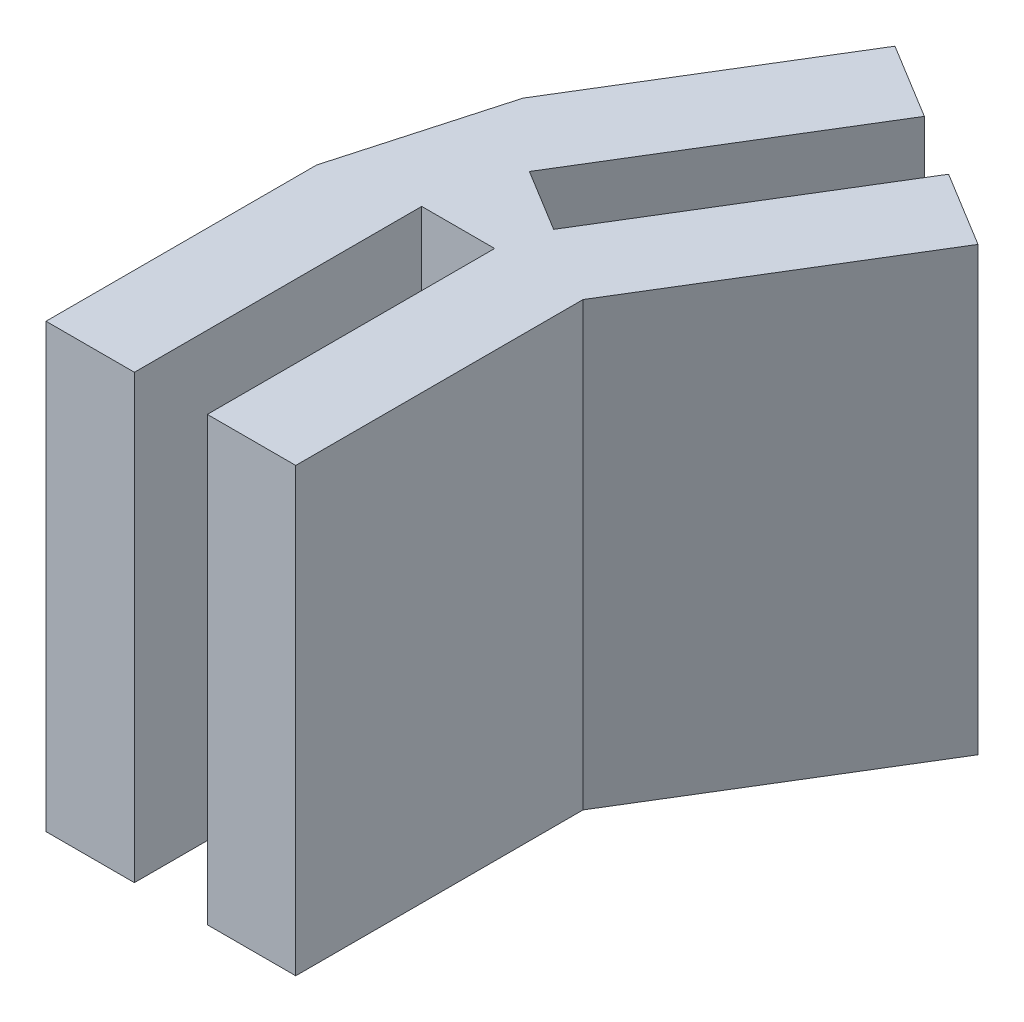
ISO-10303-21;
HEADER;
FILE_DESCRIPTION(('STEP AP214'),'2;1');
FILE_NAME('part.step','',(''),(''),'','','');
FILE_SCHEMA(('AUTOMOTIVE_DESIGN { 1 0 10303 214 1 1 1 1 }'));
ENDSEC;
DATA;
#1=APPLICATION_CONTEXT('core data for automotive mechanical design processes');
#2=APPLICATION_PROTOCOL_DEFINITION('international standard','automotive_design',2000,#1);
#3=PRODUCT_CONTEXT('',#1,'mechanical');
#4=PRODUCT('Part','Part','',(#3));
#5=PRODUCT_RELATED_PRODUCT_CATEGORY('part','',(#4));
#6=PRODUCT_DEFINITION_FORMATION('','',#4);
#7=PRODUCT_DEFINITION_CONTEXT('part definition',#1,'design');
#8=PRODUCT_DEFINITION('design','',#6,#7);
#9=PRODUCT_DEFINITION_SHAPE('','',#8);
#10=(LENGTH_UNIT() NAMED_UNIT(*) SI_UNIT(.MILLI.,.METRE.));
#11=(NAMED_UNIT(*) PLANE_ANGLE_UNIT() SI_UNIT($,.RADIAN.));
#12=(NAMED_UNIT(*) SI_UNIT($,.STERADIAN.) SOLID_ANGLE_UNIT());
#13=UNCERTAINTY_MEASURE_WITH_UNIT(LENGTH_MEASURE(1.E-05),#10,'distance_accuracy_value','');
#14=(GEOMETRIC_REPRESENTATION_CONTEXT(3) GLOBAL_UNCERTAINTY_ASSIGNED_CONTEXT((#13)) GLOBAL_UNIT_ASSIGNED_CONTEXT((#10,
#11,#12)) REPRESENTATION_CONTEXT('',''));
#15=CARTESIAN_POINT('',(0.,0.,0.));
#16=DIRECTION('',(0.,0.,1.));
#17=DIRECTION('',(1.,0.,0.));
#18=AXIS2_PLACEMENT_3D('',#15,#16,#17);
#19=CARTESIAN_POINT('',(0.,20.,-12.2410642276233));
#20=DIRECTION('',(-0.962691746426481,0.,-0.270600445975857));
#21=DIRECTION('',(0.,1.,0.));
#22=AXIS2_PLACEMENT_3D('',#19,#20,#21);
#23=PLANE('',#22);
#24=DIRECTION('',(0.,-1.,0.));
#25=VECTOR('',#24,1.);
#26=CARTESIAN_POINT('',(0.,20.,-12.2410642276233));
#27=LINE('',#26,#25);
#28=CARTESIAN_POINT('',(0.,20.,-12.2410642276233));
#29=VERTEX_POINT('',#28);
#30=CARTESIAN_POINT('',(0.,0.,-12.2410642276233));
#31=VERTEX_POINT('',#30);
#32=EDGE_CURVE('E301',#29,#31,#27,.T.);
#33=ORIENTED_EDGE('',*,*,#32,.F.);
#34=DIRECTION('',(-0.270600445975857,0.,0.962691746426481));
#35=VECTOR('',#34,1.);
#36=CARTESIAN_POINT('',(0.,20.,-12.2410642276233));
#37=LINE('',#36,#35);
#38=CARTESIAN_POINT('',(2.05028883814531,20.,-19.5351990733912));
#39=VERTEX_POINT('',#38);
#40=EDGE_CURVE('E51',#39,#29,#37,.T.);
#41=ORIENTED_EDGE('',*,*,#40,.F.);
#42=DIRECTION('',(0.,1.,0.));
#43=VECTOR('',#42,1.);
#44=CARTESIAN_POINT('',(2.05028883814531,20.,-19.5351990733912));
#45=LINE('',#44,#43);
#46=CARTESIAN_POINT('',(2.05028883814531,0.,-19.5351990733912));
#47=VERTEX_POINT('',#46);
#48=EDGE_CURVE('E305',#47,#39,#45,.T.);
#49=ORIENTED_EDGE('',*,*,#48,.F.);
#50=DIRECTION('',(0.270600445975857,0.,-0.962691746426481));
#51=VECTOR('',#50,1.);
#52=CARTESIAN_POINT('',(-3.18885618328537,0.,-0.896347048318427));
#53=LINE('',#52,#51);
#54=EDGE_CURVE('E13',#31,#47,#53,.T.);
#55=ORIENTED_EDGE('',*,*,#54,.F.);
#56=EDGE_LOOP('',(#33,#41,#49,#55));
#57=FACE_BOUND('',#56,.T.);
#58=ADVANCED_FACE('F43',(#57),#23,.T.);
#59=CARTESIAN_POINT('',(0.,20.,0.));
#60=DIRECTION('',(1.,0.,0.));
#61=DIRECTION('',(0.,0.,-1.));
#62=AXIS2_PLACEMENT_3D('',#59,#60,#61);
#63=PLANE('',#62);
#64=DIRECTION('',(0.,0.,1.));
#65=VECTOR('',#64,1.);
#66=CARTESIAN_POINT('',(0.,20.,0.));
#67=LINE('',#66,#65);
#68=CARTESIAN_POINT('',(0.,20.,0.));
#69=VERTEX_POINT('',#68);
#70=EDGE_CURVE('E234',#29,#69,#67,.T.);
#71=ORIENTED_EDGE('',*,*,#70,.F.);
#72=ORIENTED_EDGE('',*,*,#32,.T.);
#73=DIRECTION('',(0.,0.,1.));
#74=VECTOR('',#73,1.);
#75=CARTESIAN_POINT('',(0.,0.,0.));
#76=LINE('',#75,#74);
#77=CARTESIAN_POINT('',(0.,0.,0.));
#78=VERTEX_POINT('',#77);
#79=EDGE_CURVE('E159',#31,#78,#76,.T.);
#80=ORIENTED_EDGE('',*,*,#79,.T.);
#81=DIRECTION('',(0.,-1.,0.));
#82=VECTOR('',#81,1.);
#83=CARTESIAN_POINT('',(0.,20.,0.));
#84=LINE('',#83,#82);
#85=EDGE_CURVE('E297',#69,#78,#84,.T.);
#86=ORIENTED_EDGE('',*,*,#85,.F.);
#87=EDGE_LOOP('',(#71,#72,#80,#86));
#88=FACE_BOUND('',#87,.T.);
#89=ADVANCED_FACE('F313',(#88),#63,.F.);
#90=CARTESIAN_POINT('',(0.,20.,0.));
#91=DIRECTION('',(0.,0.,-1.));
#92=DIRECTION('',(-1.,0.,0.));
#93=AXIS2_PLACEMENT_3D('',#90,#91,#92);
#94=PLANE('',#93);
#95=DIRECTION('',(1.,0.,0.));
#96=VECTOR('',#95,1.);
#97=CARTESIAN_POINT('',(0.,0.,0.));
#98=LINE('',#97,#96);
#99=CARTESIAN_POINT('',(4.,0.,0.));
#100=VERTEX_POINT('',#99);
#101=EDGE_CURVE('E258',#78,#100,#98,.T.);
#102=ORIENTED_EDGE('',*,*,#101,.T.);
#103=DIRECTION('',(0.,-1.,0.));
#104=VECTOR('',#103,1.);
#105=CARTESIAN_POINT('',(4.,20.,0.));
#106=LINE('',#105,#104);
#107=CARTESIAN_POINT('',(4.,20.,0.));
#108=VERTEX_POINT('',#107);
#109=EDGE_CURVE('E293',#108,#100,#106,.T.);
#110=ORIENTED_EDGE('',*,*,#109,.F.);
#111=DIRECTION('',(1.,0.,0.));
#112=VECTOR('',#111,1.);
#113=CARTESIAN_POINT('',(0.,20.,0.));
#114=LINE('',#113,#112);
#115=EDGE_CURVE('E237',#69,#108,#114,.T.);
#116=ORIENTED_EDGE('',*,*,#115,.F.);
#117=ORIENTED_EDGE('',*,*,#85,.T.);
#118=EDGE_LOOP('',(#102,#110,#116,#117));
#119=FACE_BOUND('',#118,.T.);
#120=ADVANCED_FACE('F316',(#119),#94,.F.);
#121=CARTESIAN_POINT('',(4.,20.,0.));
#122=DIRECTION('',(-1.,0.,0.));
#123=DIRECTION('',(0.,0.,1.));
#124=AXIS2_PLACEMENT_3D('',#121,#122,#123);
#125=PLANE('',#124);
#126=DIRECTION('',(0.,0.,-1.));
#127=VECTOR('',#126,1.);
#128=CARTESIAN_POINT('',(4.,0.,0.));
#129=LINE('',#128,#127);
#130=CARTESIAN_POINT('',(4.,0.,-13.));
#131=VERTEX_POINT('',#130);
#132=EDGE_CURVE('E261',#100,#131,#129,.T.);
#133=ORIENTED_EDGE('',*,*,#132,.T.);
#134=DIRECTION('',(0.,-1.,0.));
#135=VECTOR('',#134,1.);
#136=CARTESIAN_POINT('',(4.,20.,-13.));
#137=LINE('',#136,#135);
#138=CARTESIAN_POINT('',(4.,20.,-13.));
#139=VERTEX_POINT('',#138);
#140=EDGE_CURVE('E289',#139,#131,#137,.T.);
#141=ORIENTED_EDGE('',*,*,#140,.F.);
#142=DIRECTION('',(0.,0.,-1.));
#143=VECTOR('',#142,1.);
#144=CARTESIAN_POINT('',(4.,20.,0.));
#145=LINE('',#144,#143);
#146=EDGE_CURVE('E241',#108,#139,#145,.T.);
#147=ORIENTED_EDGE('',*,*,#146,.F.);
#148=ORIENTED_EDGE('',*,*,#109,.T.);
#149=EDGE_LOOP('',(#133,#141,#147,#148));
#150=FACE_BOUND('',#149,.T.);
#151=ADVANCED_FACE('F323',(#150),#125,.F.);
#152=CARTESIAN_POINT('',(4.,20.,-13.));
#153=DIRECTION('',(0.,0.,-1.));
#154=DIRECTION('',(-1.,0.,0.));
#155=AXIS2_PLACEMENT_3D('',#152,#153,#154);
#156=PLANE('',#155);
#157=DIRECTION('',(1.,0.,0.));
#158=VECTOR('',#157,1.);
#159=CARTESIAN_POINT('',(4.,0.,-13.));
#160=LINE('',#159,#158);
#161=CARTESIAN_POINT('',(7.3,0.,-13.));
#162=VERTEX_POINT('',#161);
#163=EDGE_CURVE('E264',#131,#162,#160,.T.);
#164=ORIENTED_EDGE('',*,*,#163,.T.);
#165=DIRECTION('',(0.,-1.,0.));
#166=VECTOR('',#165,1.);
#167=CARTESIAN_POINT('',(7.3,20.,-13.));
#168=LINE('',#167,#166);
#169=CARTESIAN_POINT('',(7.3,20.,-13.));
#170=VERTEX_POINT('',#169);
#171=EDGE_CURVE('E285',#170,#162,#168,.T.);
#172=ORIENTED_EDGE('',*,*,#171,.F.);
#173=DIRECTION('',(1.,0.,0.));
#174=VECTOR('',#173,1.);
#175=CARTESIAN_POINT('',(4.,20.,-13.));
#176=LINE('',#175,#174);
#177=EDGE_CURVE('E244',#139,#170,#176,.T.);
#178=ORIENTED_EDGE('',*,*,#177,.F.);
#179=ORIENTED_EDGE('',*,*,#140,.T.);
#180=EDGE_LOOP('',(#164,#172,#178,#179));
#181=FACE_BOUND('',#180,.T.);
#182=ADVANCED_FACE('F327',(#181),#156,.F.);
#183=CARTESIAN_POINT('',(7.3,20.,-13.));
#184=DIRECTION('',(1.,0.,0.));
#185=DIRECTION('',(0.,0.,-1.));
#186=AXIS2_PLACEMENT_3D('',#183,#184,#185);
#187=PLANE('',#186);
#188=DIRECTION('',(0.,0.,1.));
#189=VECTOR('',#188,1.);
#190=CARTESIAN_POINT('',(7.3,0.,-13.));
#191=LINE('',#190,#189);
#192=CARTESIAN_POINT('',(7.3,0.,0.));
#193=VERTEX_POINT('',#192);
#194=EDGE_CURVE('E267',#162,#193,#191,.T.);
#195=ORIENTED_EDGE('',*,*,#194,.T.);
#196=DIRECTION('',(0.,-1.,0.));
#197=VECTOR('',#196,1.);
#198=CARTESIAN_POINT('',(7.3,20.,0.));
#199=LINE('',#198,#197);
#200=CARTESIAN_POINT('',(7.3,20.,0.));
#201=VERTEX_POINT('',#200);
#202=EDGE_CURVE('E281',#201,#193,#199,.T.);
#203=ORIENTED_EDGE('',*,*,#202,.F.);
#204=DIRECTION('',(0.,0.,1.));
#205=VECTOR('',#204,1.);
#206=CARTESIAN_POINT('',(7.3,20.,-13.));
#207=LINE('',#206,#205);
#208=EDGE_CURVE('E247',#170,#201,#207,.T.);
#209=ORIENTED_EDGE('',*,*,#208,.F.);
#210=ORIENTED_EDGE('',*,*,#171,.T.);
#211=EDGE_LOOP('',(#195,#203,#209,#210));
#212=FACE_BOUND('',#211,.T.);
#213=ADVANCED_FACE('F332',(#212),#187,.F.);
#214=CARTESIAN_POINT('',(7.3,20.,0.));
#215=DIRECTION('',(0.,0.,-1.));
#216=DIRECTION('',(-1.,0.,0.));
#217=AXIS2_PLACEMENT_3D('',#214,#215,#216);
#218=PLANE('',#217);
#219=DIRECTION('',(1.,0.,0.));
#220=VECTOR('',#219,1.);
#221=CARTESIAN_POINT('',(7.3,0.,0.));
#222=LINE('',#221,#220);
#223=CARTESIAN_POINT('',(11.3,0.,0.));
#224=VERTEX_POINT('',#223);
#225=EDGE_CURVE('E270',#193,#224,#222,.T.);
#226=ORIENTED_EDGE('',*,*,#225,.T.);
#227=DIRECTION('',(0.,-1.,0.));
#228=VECTOR('',#227,1.);
#229=CARTESIAN_POINT('',(11.3,20.,0.));
#230=LINE('',#229,#228);
#231=CARTESIAN_POINT('',(11.3,20.,0.));
#232=VERTEX_POINT('',#231);
#233=EDGE_CURVE('E277',#232,#224,#230,.T.);
#234=ORIENTED_EDGE('',*,*,#233,.F.);
#235=DIRECTION('',(1.,0.,0.));
#236=VECTOR('',#235,1.);
#237=CARTESIAN_POINT('',(7.3,20.,0.));
#238=LINE('',#237,#236);
#239=EDGE_CURVE('E250',#201,#232,#238,.T.);
#240=ORIENTED_EDGE('',*,*,#239,.F.);
#241=ORIENTED_EDGE('',*,*,#202,.T.);
#242=EDGE_LOOP('',(#226,#234,#240,#241));
#243=FACE_BOUND('',#242,.T.);
#244=ADVANCED_FACE('F336',(#243),#218,.F.);
#245=CARTESIAN_POINT('',(11.3,20.,0.));
#246=DIRECTION('',(-1.,0.,0.));
#247=DIRECTION('',(0.,0.,1.));
#248=AXIS2_PLACEMENT_3D('',#245,#246,#247);
#249=PLANE('',#248);
#250=DIRECTION('',(0.,0.,-1.));
#251=VECTOR('',#250,1.);
#252=CARTESIAN_POINT('',(11.3,0.,0.));
#253=LINE('',#252,#251);
#254=CARTESIAN_POINT('',(11.3,0.,-13.));
#255=VERTEX_POINT('',#254);
#256=EDGE_CURVE('E238',#224,#255,#253,.T.);
#257=ORIENTED_EDGE('',*,*,#256,.T.);
#258=DIRECTION('',(0.,-1.,0.));
#259=VECTOR('',#258,1.);
#260=CARTESIAN_POINT('',(11.3,20.,-13.));
#261=LINE('',#260,#259);
#262=CARTESIAN_POINT('',(11.3,20.,-13.));
#263=VERTEX_POINT('',#262);
#264=EDGE_CURVE('E255',#263,#255,#261,.T.);
#265=ORIENTED_EDGE('',*,*,#264,.F.);
#266=DIRECTION('',(0.,0.,-1.));
#267=VECTOR('',#266,1.);
#268=CARTESIAN_POINT('',(11.3,20.,0.));
#269=LINE('',#268,#267);
#270=EDGE_CURVE('E170',#232,#263,#269,.T.);
#271=ORIENTED_EDGE('',*,*,#270,.F.);
#272=ORIENTED_EDGE('',*,*,#233,.T.);
#273=EDGE_LOOP('',(#257,#265,#271,#272));
#274=FACE_BOUND('',#273,.T.);
#275=ADVANCED_FACE('F340',(#274),#249,.F.);
#276=CARTESIAN_POINT('',(0.,20.,0.));
#277=DIRECTION('',(0.,-1.,0.));
#278=DIRECTION('',(0.,0.,-1.));
#279=AXIS2_PLACEMENT_3D('',#276,#277,#278);
#280=PLANE('',#279);
#281=DIRECTION('',(0.521009631840564,0.,-0.853550797275335));
#282=VECTOR('',#281,1.);
#283=CARTESIAN_POINT('',(8.42800120471605,20.,-29.9835692043777));
#284=LINE('',#283,#282);
#285=CARTESIAN_POINT('',(8.42800120471605,20.,-29.9835692043777));
#286=VERTEX_POINT('',#285);
#287=EDGE_CURVE('E173',#39,#286,#284,.T.);
#288=ORIENTED_EDGE('',*,*,#287,.F.);
#289=ORIENTED_EDGE('',*,*,#40,.T.);
#290=ORIENTED_EDGE('',*,*,#70,.T.);
#291=ORIENTED_EDGE('',*,*,#115,.T.);
#292=ORIENTED_EDGE('',*,*,#146,.T.);
#293=ORIENTED_EDGE('',*,*,#177,.T.);
#294=ORIENTED_EDGE('',*,*,#208,.T.);
#295=ORIENTED_EDGE('',*,*,#239,.T.);
#296=ORIENTED_EDGE('',*,*,#270,.T.);
#297=DIRECTION('',(-0.521009631840564,0.,0.853550797275335));
#298=VECTOR('',#297,1.);
#299=CARTESIAN_POINT('',(18.0731252139273,20.,-24.0961603645794));
#300=LINE('',#299,#298);
#301=CARTESIAN_POINT('',(18.0731252139273,20.,-24.0961603645794));
#302=VERTEX_POINT('',#301);
#303=EDGE_CURVE('E151',#302,#263,#300,.T.);
#304=ORIENTED_EDGE('',*,*,#303,.F.);
#305=DIRECTION('',(0.853550797275335,0.,0.521009631840564));
#306=VECTOR('',#305,1.);
#307=CARTESIAN_POINT('',(14.658922024826,20.,-26.1801988919416));
#308=LINE('',#307,#306);
#309=CARTESIAN_POINT('',(14.658922024826,20.,-26.1801988919416));
#310=VERTEX_POINT('',#309);
#311=EDGE_CURVE('E167',#310,#302,#308,.T.);
#312=ORIENTED_EDGE('',*,*,#311,.F.);
#313=DIRECTION('',(0.521009631840564,0.,-0.853550797275335));
#314=VECTOR('',#313,1.);
#315=CARTESIAN_POINT('',(7.88579681089866,20.,-15.0840385273623));
#316=LINE('',#315,#314);
#317=CARTESIAN_POINT('',(7.88579681089866,20.,-15.0840385273623));
#318=VERTEX_POINT('',#317);
#319=EDGE_CURVE('E177',#318,#310,#316,.T.);
#320=ORIENTED_EDGE('',*,*,#319,.F.);
#321=DIRECTION('',(0.853550797275335,0.,0.521009631840564));
#322=VECTOR('',#321,1.);
#323=CARTESIAN_POINT('',(5.06907917989005,20.,-16.8033703124361));
#324=LINE('',#323,#322);
#325=CARTESIAN_POINT('',(5.06907917989005,20.,-16.8033703124361));
#326=VERTEX_POINT('',#325);
#327=EDGE_CURVE('E180',#326,#318,#324,.T.);
#328=ORIENTED_EDGE('',*,*,#327,.F.);
#329=DIRECTION('',(-0.521009631840564,0.,0.853550797275335));
#330=VECTOR('',#329,1.);
#331=CARTESIAN_POINT('',(11.8422043938174,20.,-27.8995306770155));
#332=LINE('',#331,#330);
#333=CARTESIAN_POINT('',(11.8422043938174,20.,-27.8995306770155));
#334=VERTEX_POINT('',#333);
#335=EDGE_CURVE('E187',#334,#326,#332,.T.);
#336=ORIENTED_EDGE('',*,*,#335,.F.);
#337=DIRECTION('',(0.853550797275335,0.,0.521009631840564));
#338=VECTOR('',#337,1.);
#339=CARTESIAN_POINT('',(8.42800120471605,20.,-29.9835692043777));
#340=LINE('',#339,#338);
#341=EDGE_CURVE('E191',#286,#334,#340,.T.);
#342=ORIENTED_EDGE('',*,*,#341,.F.);
#343=EDGE_LOOP('',(#288,#289,#290,#291,#292,#293,#294,#295,#296,#304,#312,#320,#328,#336,#342));
#344=FACE_BOUND('',#343,.T.);
#345=ADVANCED_FACE('F165',(#344),#280,.F.);
#346=CARTESIAN_POINT('',(0.,0.,0.));
#347=DIRECTION('',(0.,-1.,0.));
#348=DIRECTION('',(0.,0.,-1.));
#349=AXIS2_PLACEMENT_3D('',#346,#347,#348);
#350=PLANE('',#349);
#351=ORIENTED_EDGE('',*,*,#79,.F.);
#352=ORIENTED_EDGE('',*,*,#54,.T.);
#353=DIRECTION('',(0.521009631840564,0.,-0.853550797275335));
#354=VECTOR('',#353,1.);
#355=CARTESIAN_POINT('',(8.42800120471605,0.,-29.9835692043777));
#356=LINE('',#355,#354);
#357=CARTESIAN_POINT('',(8.42800120471605,0.,-29.9835692043777));
#358=VERTEX_POINT('',#357);
#359=EDGE_CURVE('E196',#47,#358,#356,.T.);
#360=ORIENTED_EDGE('',*,*,#359,.T.);
#361=DIRECTION('',(0.853550797275335,0.,0.521009631840564));
#362=VECTOR('',#361,1.);
#363=CARTESIAN_POINT('',(8.42800120471605,0.,-29.9835692043777));
#364=LINE('',#363,#362);
#365=CARTESIAN_POINT('',(11.8422043938174,0.,-27.8995306770155));
#366=VERTEX_POINT('',#365);
#367=EDGE_CURVE('E216',#358,#366,#364,.T.);
#368=ORIENTED_EDGE('',*,*,#367,.T.);
#369=DIRECTION('',(-0.521009631840564,0.,0.853550797275335));
#370=VECTOR('',#369,1.);
#371=CARTESIAN_POINT('',(11.8422043938174,0.,-27.8995306770155));
#372=LINE('',#371,#370);
#373=CARTESIAN_POINT('',(5.06907917989005,0.,-16.8033703124361));
#374=VERTEX_POINT('',#373);
#375=EDGE_CURVE('E212',#366,#374,#372,.T.);
#376=ORIENTED_EDGE('',*,*,#375,.T.);
#377=DIRECTION('',(0.853550797275335,0.,0.521009631840564));
#378=VECTOR('',#377,1.);
#379=CARTESIAN_POINT('',(5.06907917989005,0.,-16.8033703124361));
#380=LINE('',#379,#378);
#381=CARTESIAN_POINT('',(7.88579681089866,0.,-15.0840385273623));
#382=VERTEX_POINT('',#381);
#383=EDGE_CURVE('E208',#374,#382,#380,.T.);
#384=ORIENTED_EDGE('',*,*,#383,.T.);
#385=DIRECTION('',(0.521009631840564,0.,-0.853550797275335));
#386=VECTOR('',#385,1.);
#387=CARTESIAN_POINT('',(7.88579681089866,0.,-15.0840385273623));
#388=LINE('',#387,#386);
#389=CARTESIAN_POINT('',(14.658922024826,0.,-26.1801988919416));
#390=VERTEX_POINT('',#389);
#391=EDGE_CURVE('E204',#382,#390,#388,.T.);
#392=ORIENTED_EDGE('',*,*,#391,.T.);
#393=DIRECTION('',(0.853550797275335,0.,0.521009631840564));
#394=VECTOR('',#393,1.);
#395=CARTESIAN_POINT('',(14.658922024826,0.,-26.1801988919416));
#396=LINE('',#395,#394);
#397=CARTESIAN_POINT('',(18.0731252139273,0.,-24.0961603645794));
#398=VERTEX_POINT('',#397);
#399=EDGE_CURVE('E201',#390,#398,#396,.T.);
#400=ORIENTED_EDGE('',*,*,#399,.T.);
#401=DIRECTION('',(-0.521009631840564,0.,0.853550797275335));
#402=VECTOR('',#401,1.);
#403=CARTESIAN_POINT('',(18.0731252139273,0.,-24.0961603645794));
#404=LINE('',#403,#402);
#405=EDGE_CURVE('E153',#398,#255,#404,.T.);
#406=ORIENTED_EDGE('',*,*,#405,.T.);
#407=ORIENTED_EDGE('',*,*,#256,.F.);
#408=ORIENTED_EDGE('',*,*,#225,.F.);
#409=ORIENTED_EDGE('',*,*,#194,.F.);
#410=ORIENTED_EDGE('',*,*,#163,.F.);
#411=ORIENTED_EDGE('',*,*,#132,.F.);
#412=ORIENTED_EDGE('',*,*,#101,.F.);
#413=EDGE_LOOP('',(#351,#352,#360,#368,#376,#384,#392,#400,#406,#407,#408,#409,#410,#411,#412));
#414=FACE_BOUND('',#413,.T.);
#415=ADVANCED_FACE('F341',(#414),#350,.T.);
#416=CARTESIAN_POINT('',(8.42800120471605,20.,-29.9835692043777));
#417=DIRECTION('',(-0.853550797275335,0.,-0.521009631840564));
#418=DIRECTION('',(-0.521009631840564,0.,0.853550797275335));
#419=AXIS2_PLACEMENT_3D('',#416,#417,#418);
#420=PLANE('',#419);
#421=ORIENTED_EDGE('',*,*,#359,.F.);
#422=ORIENTED_EDGE('',*,*,#48,.T.);
#423=ORIENTED_EDGE('',*,*,#287,.T.);
#424=DIRECTION('',(0.,-1.,0.));
#425=VECTOR('',#424,1.);
#426=CARTESIAN_POINT('',(8.42800120471605,20.,-29.9835692043777));
#427=LINE('',#426,#425);
#428=EDGE_CURVE('E195',#286,#358,#427,.T.);
#429=ORIENTED_EDGE('',*,*,#428,.T.);
#430=EDGE_LOOP('',(#421,#422,#423,#429));
#431=FACE_BOUND('',#430,.T.);
#432=ADVANCED_FACE('F359',(#431),#420,.T.);
#433=CARTESIAN_POINT('',(18.0731252139273,20.,-24.0961603645794));
#434=DIRECTION('',(0.853550797275335,0.,0.521009631840564));
#435=DIRECTION('',(0.521009631840564,0.,-0.853550797275335));
#436=AXIS2_PLACEMENT_3D('',#433,#434,#435);
#437=PLANE('',#436);
#438=ORIENTED_EDGE('',*,*,#405,.F.);
#439=DIRECTION('',(0.,-1.,0.));
#440=VECTOR('',#439,1.);
#441=CARTESIAN_POINT('',(18.0731252139273,20.,-24.0961603645794));
#442=LINE('',#441,#440);
#443=EDGE_CURVE('E147',#302,#398,#442,.T.);
#444=ORIENTED_EDGE('',*,*,#443,.F.);
#445=ORIENTED_EDGE('',*,*,#303,.T.);
#446=ORIENTED_EDGE('',*,*,#264,.T.);
#447=EDGE_LOOP('',(#438,#444,#445,#446));
#448=FACE_BOUND('',#447,.T.);
#449=ADVANCED_FACE('F149',(#448),#437,.T.);
#450=CARTESIAN_POINT('',(14.658922024826,20.,-26.1801988919416));
#451=DIRECTION('',(0.521009631840564,0.,-0.853550797275335));
#452=DIRECTION('',(-0.853550797275335,0.,-0.521009631840564));
#453=AXIS2_PLACEMENT_3D('',#450,#451,#452);
#454=PLANE('',#453);
#455=ORIENTED_EDGE('',*,*,#399,.F.);
#456=DIRECTION('',(0.,-1.,0.));
#457=VECTOR('',#456,1.);
#458=CARTESIAN_POINT('',(14.658922024826,20.,-26.1801988919416));
#459=LINE('',#458,#457);
#460=EDGE_CURVE('E160',#310,#390,#459,.T.);
#461=ORIENTED_EDGE('',*,*,#460,.F.);
#462=ORIENTED_EDGE('',*,*,#311,.T.);
#463=ORIENTED_EDGE('',*,*,#443,.T.);
#464=EDGE_LOOP('',(#455,#461,#462,#463));
#465=FACE_BOUND('',#464,.T.);
#466=ADVANCED_FACE('F175',(#465),#454,.T.);
#467=CARTESIAN_POINT('',(7.88579681089866,20.,-15.0840385273623));
#468=DIRECTION('',(-0.853550797275335,0.,-0.521009631840564));
#469=DIRECTION('',(-0.521009631840564,0.,0.853550797275335));
#470=AXIS2_PLACEMENT_3D('',#467,#468,#469);
#471=PLANE('',#470);
#472=ORIENTED_EDGE('',*,*,#391,.F.);
#473=DIRECTION('',(0.,-1.,0.));
#474=VECTOR('',#473,1.);
#475=CARTESIAN_POINT('',(7.88579681089866,20.,-15.0840385273623));
#476=LINE('',#475,#474);
#477=EDGE_CURVE('E229',#318,#382,#476,.T.);
#478=ORIENTED_EDGE('',*,*,#477,.F.);
#479=ORIENTED_EDGE('',*,*,#319,.T.);
#480=ORIENTED_EDGE('',*,*,#460,.T.);
#481=EDGE_LOOP('',(#472,#478,#479,#480));
#482=FACE_BOUND('',#481,.T.);
#483=ADVANCED_FACE('F345',(#482),#471,.T.);
#484=CARTESIAN_POINT('',(5.06907917989005,20.,-16.8033703124361));
#485=DIRECTION('',(0.521009631840564,0.,-0.853550797275335));
#486=DIRECTION('',(-0.853550797275335,0.,-0.521009631840564));
#487=AXIS2_PLACEMENT_3D('',#484,#485,#486);
#488=PLANE('',#487);
#489=ORIENTED_EDGE('',*,*,#383,.F.);
#490=DIRECTION('',(0.,-1.,0.));
#491=VECTOR('',#490,1.);
#492=CARTESIAN_POINT('',(5.06907917989005,20.,-16.8033703124361));
#493=LINE('',#492,#491);
#494=EDGE_CURVE('E226',#326,#374,#493,.T.);
#495=ORIENTED_EDGE('',*,*,#494,.F.);
#496=ORIENTED_EDGE('',*,*,#327,.T.);
#497=ORIENTED_EDGE('',*,*,#477,.T.);
#498=EDGE_LOOP('',(#489,#495,#496,#497));
#499=FACE_BOUND('',#498,.T.);
#500=ADVANCED_FACE('F349',(#499),#488,.T.);
#501=CARTESIAN_POINT('',(11.8422043938174,20.,-27.8995306770155));
#502=DIRECTION('',(0.853550797275335,0.,0.521009631840564));
#503=DIRECTION('',(0.521009631840564,0.,-0.853550797275335));
#504=AXIS2_PLACEMENT_3D('',#501,#502,#503);
#505=PLANE('',#504);
#506=ORIENTED_EDGE('',*,*,#375,.F.);
#507=DIRECTION('',(0.,-1.,0.));
#508=VECTOR('',#507,1.);
#509=CARTESIAN_POINT('',(11.8422043938174,20.,-27.8995306770155));
#510=LINE('',#509,#508);
#511=EDGE_CURVE('E223',#334,#366,#510,.T.);
#512=ORIENTED_EDGE('',*,*,#511,.F.);
#513=ORIENTED_EDGE('',*,*,#335,.T.);
#514=ORIENTED_EDGE('',*,*,#494,.T.);
#515=EDGE_LOOP('',(#506,#512,#513,#514));
#516=FACE_BOUND('',#515,.T.);
#517=ADVANCED_FACE('F352',(#516),#505,.T.);
#518=CARTESIAN_POINT('',(8.42800120471605,20.,-29.9835692043777));
#519=DIRECTION('',(0.521009631840564,0.,-0.853550797275335));
#520=DIRECTION('',(-0.853550797275335,0.,-0.521009631840564));
#521=AXIS2_PLACEMENT_3D('',#518,#519,#520);
#522=PLANE('',#521);
#523=ORIENTED_EDGE('',*,*,#367,.F.);
#524=ORIENTED_EDGE('',*,*,#428,.F.);
#525=ORIENTED_EDGE('',*,*,#341,.T.);
#526=ORIENTED_EDGE('',*,*,#511,.T.);
#527=EDGE_LOOP('',(#523,#524,#525,#526));
#528=FACE_BOUND('',#527,.T.);
#529=ADVANCED_FACE('F356',(#528),#522,.T.);
#530=CLOSED_SHELL('',(#58,#89,#120,#151,#182,#213,#244,#275,#345,#415,#432,#449,#466,#483,#500,
#517,#529));
#531=MANIFOLD_SOLID_BREP('B2',#530);
#532=ADVANCED_BREP_SHAPE_REPRESENTATION('',(#18,#531),#14);
#533=SHAPE_DEFINITION_REPRESENTATION(#9,#532);
ENDSEC;
END-ISO-10303-21;
